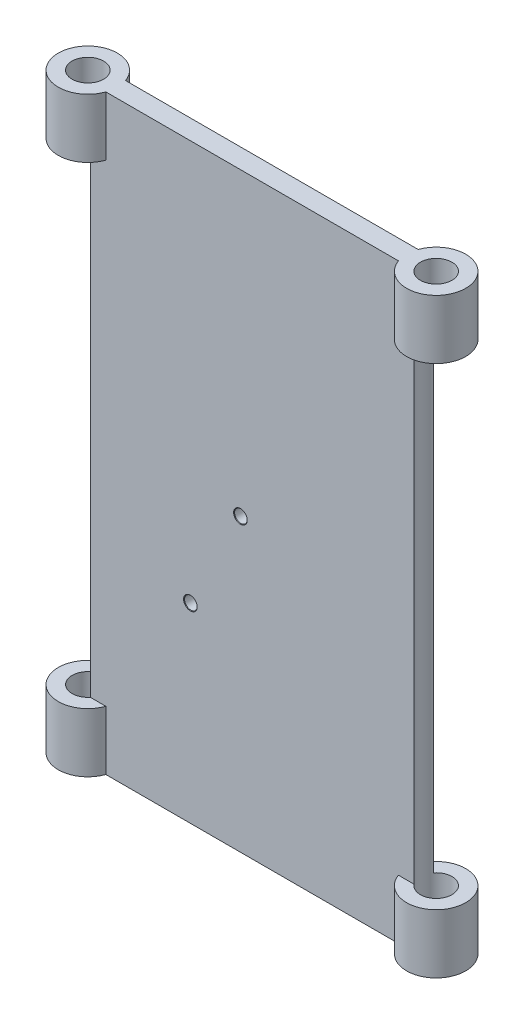
ISO-10303-21;
HEADER;
FILE_DESCRIPTION(('STEP AP214'),'2;1');
FILE_NAME('part.step','',(''),(''),'','','');
FILE_SCHEMA(('AUTOMOTIVE_DESIGN { 1 0 10303 214 1 1 1 1 }'));
ENDSEC;
DATA;
#1=APPLICATION_CONTEXT('core data for automotive mechanical design processes');
#2=APPLICATION_PROTOCOL_DEFINITION('international standard','automotive_design',2000,#1);
#3=PRODUCT_CONTEXT('',#1,'mechanical');
#4=PRODUCT('Part','Part','',(#3));
#5=PRODUCT_RELATED_PRODUCT_CATEGORY('part','',(#4));
#6=PRODUCT_DEFINITION_FORMATION('','',#4);
#7=PRODUCT_DEFINITION_CONTEXT('part definition',#1,'design');
#8=PRODUCT_DEFINITION('design','',#6,#7);
#9=PRODUCT_DEFINITION_SHAPE('','',#8);
#10=(LENGTH_UNIT() NAMED_UNIT(*) SI_UNIT(.MILLI.,.METRE.));
#11=(NAMED_UNIT(*) PLANE_ANGLE_UNIT() SI_UNIT($,.RADIAN.));
#12=(NAMED_UNIT(*) SI_UNIT($,.STERADIAN.) SOLID_ANGLE_UNIT());
#13=UNCERTAINTY_MEASURE_WITH_UNIT(LENGTH_MEASURE(1.E-05),#10,'distance_accuracy_value','');
#14=(GEOMETRIC_REPRESENTATION_CONTEXT(3) GLOBAL_UNCERTAINTY_ASSIGNED_CONTEXT((#13)) GLOBAL_UNIT_ASSIGNED_CONTEXT((#10,
#11,#12)) REPRESENTATION_CONTEXT('',''));
#15=CARTESIAN_POINT('',(0.,0.,0.));
#16=DIRECTION('',(0.,0.,1.));
#17=DIRECTION('',(1.,0.,0.));
#18=AXIS2_PLACEMENT_3D('',#15,#16,#17);
#19=CARTESIAN_POINT('',(0.,0.,5.));
#20=DIRECTION('',(0.,0.,-1.));
#21=DIRECTION('',(-1.,0.,0.));
#22=AXIS2_PLACEMENT_3D('',#19,#20,#21);
#23=PLANE('',#22);
#24=CARTESIAN_POINT('',(41.2224989991992,73.8,5.));
#25=DIRECTION('',(0.,0.,1.));
#26=DIRECTION('',(1.,0.,0.));
#27=AXIS2_PLACEMENT_3D('',#24,#25,#26);
#28=CIRCLE('',#27,1.725);
#29=CARTESIAN_POINT('',(42.9474989991992,73.8,5.));
#30=VERTEX_POINT('',#29);
#31=EDGE_CURVE('E346',#30,#30,#28,.T.);
#32=ORIENTED_EDGE('',*,*,#31,.F.);
#33=EDGE_LOOP('',(#32));
#34=FACE_BOUND('',#33,.T.);
#35=DIRECTION('',(1.,0.,0.));
#36=VECTOR('',#35,1.);
#37=CARTESIAN_POINT('',(0.,0.,5.));
#38=LINE('',#37,#36);
#39=CARTESIAN_POINT('',(7.07106781186548,0.,5.));
#40=VERTEX_POINT('',#39);
#41=CARTESIAN_POINT('',(81.3189321881345,0.,5.));
#42=VERTEX_POINT('',#41);
#43=EDGE_CURVE('E186',#40,#42,#38,.T.);
#44=ORIENTED_EDGE('',*,*,#43,.T.);
#45=DIRECTION('',(0.,-1.,0.));
#46=VECTOR('',#45,1.);
#47=CARTESIAN_POINT('',(81.3189321881345,15.,5.));
#48=LINE('',#47,#46);
#49=CARTESIAN_POINT('',(81.3189321881345,15.,5.));
#50=VERTEX_POINT('',#49);
#51=EDGE_CURVE('E234',#50,#42,#48,.T.);
#52=ORIENTED_EDGE('',*,*,#51,.F.);
#53=DIRECTION('',(1.,0.,0.));
#54=VECTOR('',#53,1.);
#55=CARTESIAN_POINT('',(81.3189321881345,15.,5.));
#56=LINE('',#55,#54);
#57=CARTESIAN_POINT('',(85.2675010008008,15.,5.));
#58=VERTEX_POINT('',#57);
#59=EDGE_CURVE('E228',#50,#58,#56,.T.);
#60=ORIENTED_EDGE('',*,*,#59,.T.);
#61=DIRECTION('',(0.,1.,0.));
#62=VECTOR('',#61,1.);
#63=CARTESIAN_POINT('',(85.2675010008008,150.,5.));
#64=LINE('',#63,#62);
#65=CARTESIAN_POINT('',(85.2675010008008,135.,5.));
#66=VERTEX_POINT('',#65);
#67=EDGE_CURVE('E137',#58,#66,#64,.T.);
#68=ORIENTED_EDGE('',*,*,#67,.T.);
#69=DIRECTION('',(1.,0.,0.));
#70=VECTOR('',#69,1.);
#71=CARTESIAN_POINT('',(0.,135.,5.));
#72=LINE('',#71,#70);
#73=CARTESIAN_POINT('',(81.3189321881345,135.,5.));
#74=VERTEX_POINT('',#73);
#75=EDGE_CURVE('E179',#74,#66,#72,.T.);
#76=ORIENTED_EDGE('',*,*,#75,.F.);
#77=DIRECTION('',(0.,1.,0.));
#78=VECTOR('',#77,1.);
#79=CARTESIAN_POINT('',(81.3189321881345,135.,5.));
#80=LINE('',#79,#78);
#81=CARTESIAN_POINT('',(81.3189321881345,150.,5.));
#82=VERTEX_POINT('',#81);
#83=EDGE_CURVE('E182',#74,#82,#80,.T.);
#84=ORIENTED_EDGE('',*,*,#83,.T.);
#85=DIRECTION('',(-1.,0.,0.));
#86=VECTOR('',#85,1.);
#87=CARTESIAN_POINT('',(0.,150.,5.));
#88=LINE('',#87,#86);
#89=CARTESIAN_POINT('',(7.07106781186548,150.,5.));
#90=VERTEX_POINT('',#89);
#91=EDGE_CURVE('E189',#82,#90,#88,.T.);
#92=ORIENTED_EDGE('',*,*,#91,.T.);
#93=DIRECTION('',(0.,1.,0.));
#94=VECTOR('',#93,1.);
#95=CARTESIAN_POINT('',(7.07106781186548,135.,5.));
#96=LINE('',#95,#94);
#97=CARTESIAN_POINT('',(7.07106781186548,135.,5.));
#98=VERTEX_POINT('',#97);
#99=EDGE_CURVE('E176',#90,#98,#96,.F.);
#100=ORIENTED_EDGE('',*,*,#99,.T.);
#101=DIRECTION('',(1.,0.,0.));
#102=VECTOR('',#101,1.);
#103=CARTESIAN_POINT('',(0.,135.,5.));
#104=LINE('',#103,#102);
#105=CARTESIAN_POINT('',(3.12249899919921,135.,5.));
#106=VERTEX_POINT('',#105);
#107=EDGE_CURVE('E168',#106,#98,#104,.T.);
#108=ORIENTED_EDGE('',*,*,#107,.F.);
#109=DIRECTION('',(0.,1.,0.));
#110=VECTOR('',#109,1.);
#111=CARTESIAN_POINT('',(3.12249899919921,150.,5.));
#112=LINE('',#111,#110);
#113=CARTESIAN_POINT('',(3.12249899919921,15.,5.));
#114=VERTEX_POINT('',#113);
#115=EDGE_CURVE('E161',#106,#114,#112,.F.);
#116=ORIENTED_EDGE('',*,*,#115,.T.);
#117=DIRECTION('',(1.,0.,0.));
#118=VECTOR('',#117,1.);
#119=CARTESIAN_POINT('',(3.1224989991992,15.,4.99999999999999));
#120=LINE('',#119,#118);
#121=CARTESIAN_POINT('',(7.07106781186548,15.,5.));
#122=VERTEX_POINT('',#121);
#123=EDGE_CURVE('E245',#114,#122,#120,.T.);
#124=ORIENTED_EDGE('',*,*,#123,.T.);
#125=DIRECTION('',(0.,-1.,0.));
#126=VECTOR('',#125,1.);
#127=CARTESIAN_POINT('',(7.07106781186548,15.,5.));
#128=LINE('',#127,#126);
#129=EDGE_CURVE('E238',#122,#40,#128,.T.);
#130=ORIENTED_EDGE('',*,*,#129,.T.);
#131=EDGE_LOOP('',(#44,#52,#60,#68,#76,#84,#92,#100,#108,#116,#124,#130));
#132=FACE_BOUND('',#131,.T.);
#133=CARTESIAN_POINT('',(28.5224989991992,48.4,5.));
#134=DIRECTION('',(0.,0.,1.));
#135=DIRECTION('',(1.,0.,0.));
#136=AXIS2_PLACEMENT_3D('',#133,#134,#135);
#137=CIRCLE('',#136,1.725);
#138=CARTESIAN_POINT('',(30.2474989991992,48.4,5.));
#139=VERTEX_POINT('',#138);
#140=EDGE_CURVE('E216',#139,#139,#137,.T.);
#141=ORIENTED_EDGE('',*,*,#140,.F.);
#142=EDGE_LOOP('',(#141));
#143=FACE_BOUND('',#142,.T.);
#144=ADVANCED_FACE('F39',(#34,#132,#143),#23,.F.);
#145=CARTESIAN_POINT('',(88.39,150.,2.5));
#146=DIRECTION('',(0.,1.,0.));
#147=DIRECTION('',(0.,0.,1.));
#148=AXIS2_PLACEMENT_3D('',#145,#146,#147);
#149=CYLINDRICAL_SURFACE('',#148,4.);
#150=CARTESIAN_POINT('',(88.39,150.,2.5));
#151=DIRECTION('',(0.,1.,0.));
#152=DIRECTION('',(0.,0.,1.));
#153=AXIS2_PLACEMENT_3D('',#150,#151,#152);
#154=CIRCLE('',#153,4.00000000000002);
#155=CARTESIAN_POINT('',(88.39,150.,6.50000000000002));
#156=VERTEX_POINT('',#155);
#157=EDGE_CURVE('E156',#156,#156,#154,.T.);
#158=ORIENTED_EDGE('',*,*,#157,.T.);
#159=EDGE_LOOP('',(#158));
#160=FACE_BOUND('',#159,.T.);
#161=ORIENTED_EDGE('',*,*,#67,.F.);
#162=CARTESIAN_POINT('',(88.39,15.,2.5));
#163=DIRECTION('',(0.,-1.,0.));
#164=DIRECTION('',(0.,0.,-1.));
#165=AXIS2_PLACEMENT_3D('',#162,#163,#164);
#166=CIRCLE('',#165,4.00000000000002);
#167=CARTESIAN_POINT('',(85.2675010008008,15.,0.));
#168=VERTEX_POINT('',#167);
#169=EDGE_CURVE('E48',#168,#58,#166,.T.);
#170=ORIENTED_EDGE('',*,*,#169,.F.);
#171=DIRECTION('',(0.,1.,0.));
#172=VECTOR('',#171,1.);
#173=CARTESIAN_POINT('',(85.2675010008008,150.,0.));
#174=LINE('',#173,#172);
#175=CARTESIAN_POINT('',(85.2675010008008,135.,0.));
#176=VERTEX_POINT('',#175);
#177=EDGE_CURVE('E135',#168,#176,#174,.T.);
#178=ORIENTED_EDGE('',*,*,#177,.T.);
#179=CARTESIAN_POINT('',(88.39,135.,2.5));
#180=DIRECTION('',(0.,1.,0.));
#181=DIRECTION('',(0.,0.,1.));
#182=AXIS2_PLACEMENT_3D('',#179,#180,#181);
#183=CIRCLE('',#182,4.);
#184=EDGE_CURVE('E204',#66,#176,#183,.T.);
#185=ORIENTED_EDGE('',*,*,#184,.F.);
#186=EDGE_LOOP('',(#161,#170,#178,#185));
#187=FACE_BOUND('',#186,.T.);
#188=CARTESIAN_POINT('',(88.39,0.,2.5));
#189=DIRECTION('',(0.,1.,0.));
#190=DIRECTION('',(0.,0.,1.));
#191=AXIS2_PLACEMENT_3D('',#188,#189,#190);
#192=CIRCLE('',#191,4.00000000000002);
#193=CARTESIAN_POINT('',(88.39,0.,6.50000000000002));
#194=VERTEX_POINT('',#193);
#195=EDGE_CURVE('E208',#194,#194,#192,.T.);
#196=ORIENTED_EDGE('',*,*,#195,.F.);
#197=EDGE_LOOP('',(#196));
#198=FACE_BOUND('',#197,.T.);
#199=ADVANCED_FACE('F131',(#160,#187,#198),#149,.F.);
#200=CARTESIAN_POINT('',(0.,150.,2.5));
#201=DIRECTION('',(0.,1.,0.));
#202=DIRECTION('',(0.,0.,1.));
#203=AXIS2_PLACEMENT_3D('',#200,#201,#202);
#204=CYLINDRICAL_SURFACE('',#203,4.);
#205=CARTESIAN_POINT('',(0.,150.,2.5));
#206=DIRECTION('',(0.,1.,0.));
#207=DIRECTION('',(0.,0.,1.));
#208=AXIS2_PLACEMENT_3D('',#205,#206,#207);
#209=CIRCLE('',#208,4.00000000000001);
#210=CARTESIAN_POINT('',(0.,150.,6.50000000000001));
#211=VERTEX_POINT('',#210);
#212=EDGE_CURVE('E236',#211,#211,#209,.T.);
#213=ORIENTED_EDGE('',*,*,#212,.T.);
#214=EDGE_LOOP('',(#213));
#215=FACE_BOUND('',#214,.T.);
#216=DIRECTION('',(0.,1.,0.));
#217=VECTOR('',#216,1.);
#218=CARTESIAN_POINT('',(3.12249899919921,150.,0.));
#219=LINE('',#218,#217);
#220=CARTESIAN_POINT('',(3.12249899919921,135.,0.));
#221=VERTEX_POINT('',#220);
#222=CARTESIAN_POINT('',(3.12249899919919,15.,0.));
#223=VERTEX_POINT('',#222);
#224=EDGE_CURVE('E141',#221,#223,#219,.F.);
#225=ORIENTED_EDGE('',*,*,#224,.T.);
#226=CARTESIAN_POINT('',(0.,15.,2.5));
#227=DIRECTION('',(0.,-1.,0.));
#228=DIRECTION('',(0.,0.,-1.));
#229=AXIS2_PLACEMENT_3D('',#226,#227,#228);
#230=CIRCLE('',#229,4.00000000000001);
#231=EDGE_CURVE('E11',#114,#223,#230,.T.);
#232=ORIENTED_EDGE('',*,*,#231,.F.);
#233=ORIENTED_EDGE('',*,*,#115,.F.);
#234=CARTESIAN_POINT('',(0.,135.,2.5));
#235=DIRECTION('',(0.,1.,0.));
#236=DIRECTION('',(0.,0.,1.));
#237=AXIS2_PLACEMENT_3D('',#234,#235,#236);
#238=CIRCLE('',#237,4.);
#239=EDGE_CURVE('E56',#221,#106,#238,.T.);
#240=ORIENTED_EDGE('',*,*,#239,.F.);
#241=EDGE_LOOP('',(#225,#232,#233,#240));
#242=FACE_BOUND('',#241,.T.);
#243=CARTESIAN_POINT('',(0.,0.,2.5));
#244=DIRECTION('',(0.,1.,0.));
#245=DIRECTION('',(0.,0.,1.));
#246=AXIS2_PLACEMENT_3D('',#243,#244,#245);
#247=CIRCLE('',#246,4.00000000000001);
#248=CARTESIAN_POINT('',(0.,0.,6.50000000000001));
#249=VERTEX_POINT('',#248);
#250=EDGE_CURVE('E213',#249,#249,#247,.T.);
#251=ORIENTED_EDGE('',*,*,#250,.F.);
#252=EDGE_LOOP('',(#251));
#253=FACE_BOUND('',#252,.T.);
#254=ADVANCED_FACE('F259',(#215,#242,#253),#204,.F.);
#255=CARTESIAN_POINT('',(0.,150.,5.));
#256=DIRECTION('',(0.,-1.,0.));
#257=DIRECTION('',(0.,0.,-1.));
#258=AXIS2_PLACEMENT_3D('',#255,#256,#257);
#259=PLANE('',#258);
#260=ORIENTED_EDGE('',*,*,#212,.F.);
#261=EDGE_LOOP('',(#260));
#262=FACE_BOUND('',#261,.T.);
#263=ORIENTED_EDGE('',*,*,#91,.F.);
#264=CARTESIAN_POINT('',(88.39,150.,2.5));
#265=DIRECTION('',(0.,1.,0.));
#266=DIRECTION('',(0.,0.,1.));
#267=AXIS2_PLACEMENT_3D('',#264,#265,#266);
#268=CIRCLE('',#267,7.50000000000001);
#269=CARTESIAN_POINT('',(81.3189321881345,150.,0.));
#270=VERTEX_POINT('',#269);
#271=EDGE_CURVE('E64',#82,#270,#268,.T.);
#272=ORIENTED_EDGE('',*,*,#271,.T.);
#273=DIRECTION('',(-1.,0.,0.));
#274=VECTOR('',#273,1.);
#275=CARTESIAN_POINT('',(0.,150.,0.));
#276=LINE('',#275,#274);
#277=CARTESIAN_POINT('',(7.07106781186548,150.,0.));
#278=VERTEX_POINT('',#277);
#279=EDGE_CURVE('E190',#270,#278,#276,.T.);
#280=ORIENTED_EDGE('',*,*,#279,.T.);
#281=CARTESIAN_POINT('',(0.,150.,2.5));
#282=DIRECTION('',(0.,1.,0.));
#283=DIRECTION('',(0.,0.,1.));
#284=AXIS2_PLACEMENT_3D('',#281,#282,#283);
#285=CIRCLE('',#284,7.5);
#286=EDGE_CURVE('E170',#278,#90,#285,.T.);
#287=ORIENTED_EDGE('',*,*,#286,.T.);
#288=EDGE_LOOP('',(#263,#272,#280,#287));
#289=FACE_BOUND('',#288,.T.);
#290=ORIENTED_EDGE('',*,*,#157,.F.);
#291=EDGE_LOOP('',(#290));
#292=FACE_BOUND('',#291,.T.);
#293=ADVANCED_FACE('F269',(#262,#289,#292),#259,.F.);
#294=CARTESIAN_POINT('',(0.,0.,5.));
#295=DIRECTION('',(0.,1.,0.));
#296=DIRECTION('',(0.,0.,1.));
#297=AXIS2_PLACEMENT_3D('',#294,#295,#296);
#298=PLANE('',#297);
#299=ORIENTED_EDGE('',*,*,#250,.T.);
#300=EDGE_LOOP('',(#299));
#301=FACE_BOUND('',#300,.T.);
#302=ORIENTED_EDGE('',*,*,#195,.T.);
#303=EDGE_LOOP('',(#302));
#304=FACE_BOUND('',#303,.T.);
#305=ORIENTED_EDGE('',*,*,#43,.F.);
#306=CARTESIAN_POINT('',(0.,0.,2.5));
#307=DIRECTION('',(0.,-1.,0.));
#308=DIRECTION('',(0.,0.,-1.));
#309=AXIS2_PLACEMENT_3D('',#306,#307,#308);
#310=CIRCLE('',#309,7.5);
#311=CARTESIAN_POINT('',(7.07106781186548,0.,0.));
#312=VERTEX_POINT('',#311);
#313=EDGE_CURVE('E233',#40,#312,#310,.T.);
#314=ORIENTED_EDGE('',*,*,#313,.T.);
#315=DIRECTION('',(1.,0.,0.));
#316=VECTOR('',#315,1.);
#317=CARTESIAN_POINT('',(0.,0.,0.));
#318=LINE('',#317,#316);
#319=CARTESIAN_POINT('',(81.3189321881345,0.,0.));
#320=VERTEX_POINT('',#319);
#321=EDGE_CURVE('E185',#312,#320,#318,.T.);
#322=ORIENTED_EDGE('',*,*,#321,.T.);
#323=CARTESIAN_POINT('',(88.39,0.,2.5));
#324=DIRECTION('',(0.,-1.,0.));
#325=DIRECTION('',(0.,0.,-1.));
#326=AXIS2_PLACEMENT_3D('',#323,#324,#325);
#327=CIRCLE('',#326,7.50000000000002);
#328=EDGE_CURVE('E150',#320,#42,#327,.T.);
#329=ORIENTED_EDGE('',*,*,#328,.T.);
#330=EDGE_LOOP('',(#305,#314,#322,#329));
#331=FACE_BOUND('',#330,.T.);
#332=ADVANCED_FACE('F41',(#301,#304,#331),#298,.F.);
#333=CARTESIAN_POINT('',(0.,0.,0.));
#334=DIRECTION('',(0.,0.,-1.));
#335=DIRECTION('',(-1.,0.,0.));
#336=AXIS2_PLACEMENT_3D('',#333,#334,#335);
#337=PLANE('',#336);
#338=CARTESIAN_POINT('',(41.2224989991992,73.8,0.));
#339=DIRECTION('',(0.,0.,-1.));
#340=DIRECTION('',(-1.,0.,0.));
#341=AXIS2_PLACEMENT_3D('',#338,#339,#340);
#342=CIRCLE('',#341,1.6);
#343=CARTESIAN_POINT('',(39.6224989991992,73.8,0.));
#344=VERTEX_POINT('',#343);
#345=EDGE_CURVE('E43',#344,#344,#342,.T.);
#346=ORIENTED_EDGE('',*,*,#345,.F.);
#347=EDGE_LOOP('',(#346));
#348=FACE_BOUND('',#347,.T.);
#349=CARTESIAN_POINT('',(28.5224989991992,48.4,0.));
#350=DIRECTION('',(0.,0.,-1.));
#351=DIRECTION('',(-1.,0.,0.));
#352=AXIS2_PLACEMENT_3D('',#349,#350,#351);
#353=CIRCLE('',#352,1.6);
#354=CARTESIAN_POINT('',(26.9224989991992,48.4,0.));
#355=VERTEX_POINT('',#354);
#356=EDGE_CURVE('E206',#355,#355,#353,.T.);
#357=ORIENTED_EDGE('',*,*,#356,.F.);
#358=EDGE_LOOP('',(#357));
#359=FACE_BOUND('',#358,.T.);
#360=DIRECTION('',(0.,-1.,0.));
#361=VECTOR('',#360,1.);
#362=CARTESIAN_POINT('',(81.3189321881345,15.,0.));
#363=LINE('',#362,#361);
#364=CARTESIAN_POINT('',(81.3189321881345,15.,0.));
#365=VERTEX_POINT('',#364);
#366=EDGE_CURVE('E230',#365,#320,#363,.T.);
#367=ORIENTED_EDGE('',*,*,#366,.T.);
#368=ORIENTED_EDGE('',*,*,#321,.F.);
#369=DIRECTION('',(0.,-1.,0.));
#370=VECTOR('',#369,1.);
#371=CARTESIAN_POINT('',(7.07106781186548,15.,0.));
#372=LINE('',#371,#370);
#373=CARTESIAN_POINT('',(7.07106781186548,15.,0.));
#374=VERTEX_POINT('',#373);
#375=EDGE_CURVE('E225',#374,#312,#372,.T.);
#376=ORIENTED_EDGE('',*,*,#375,.F.);
#377=DIRECTION('',(-1.,0.,0.));
#378=VECTOR('',#377,1.);
#379=CARTESIAN_POINT('',(3.12249899919919,15.,0.));
#380=LINE('',#379,#378);
#381=EDGE_CURVE('E241',#374,#223,#380,.T.);
#382=ORIENTED_EDGE('',*,*,#381,.T.);
#383=ORIENTED_EDGE('',*,*,#224,.F.);
#384=DIRECTION('',(1.,0.,0.));
#385=VECTOR('',#384,1.);
#386=CARTESIAN_POINT('',(0.,135.,0.));
#387=LINE('',#386,#385);
#388=CARTESIAN_POINT('',(7.07106781186548,135.,0.));
#389=VERTEX_POINT('',#388);
#390=EDGE_CURVE('E193',#221,#389,#387,.T.);
#391=ORIENTED_EDGE('',*,*,#390,.T.);
#392=DIRECTION('',(0.,1.,0.));
#393=VECTOR('',#392,1.);
#394=CARTESIAN_POINT('',(7.07106781186548,135.,0.));
#395=LINE('',#394,#393);
#396=EDGE_CURVE('E198',#278,#389,#395,.F.);
#397=ORIENTED_EDGE('',*,*,#396,.F.);
#398=ORIENTED_EDGE('',*,*,#279,.F.);
#399=DIRECTION('',(0.,1.,0.));
#400=VECTOR('',#399,1.);
#401=CARTESIAN_POINT('',(81.3189321881345,135.,0.));
#402=LINE('',#401,#400);
#403=CARTESIAN_POINT('',(81.3189321881345,135.,0.));
#404=VERTEX_POINT('',#403);
#405=EDGE_CURVE('E202',#404,#270,#402,.T.);
#406=ORIENTED_EDGE('',*,*,#405,.F.);
#407=DIRECTION('',(1.,0.,0.));
#408=VECTOR('',#407,1.);
#409=CARTESIAN_POINT('',(0.,135.,0.));
#410=LINE('',#409,#408);
#411=EDGE_CURVE('E155',#404,#176,#410,.T.);
#412=ORIENTED_EDGE('',*,*,#411,.T.);
#413=ORIENTED_EDGE('',*,*,#177,.F.);
#414=DIRECTION('',(-1.,0.,0.));
#415=VECTOR('',#414,1.);
#416=CARTESIAN_POINT('',(81.3189321881345,15.,0.));
#417=LINE('',#416,#415);
#418=EDGE_CURVE('E145',#168,#365,#417,.T.);
#419=ORIENTED_EDGE('',*,*,#418,.T.);
#420=EDGE_LOOP('',(#367,#368,#376,#382,#383,#391,#397,#398,#406,#412,#413,#419));
#421=FACE_BOUND('',#420,.T.);
#422=ADVANCED_FACE('F153',(#348,#359,#421),#337,.T.);
#423=CARTESIAN_POINT('',(0.,135.,2.5));
#424=DIRECTION('',(0.,1.,0.));
#425=DIRECTION('',(0.,0.,1.));
#426=AXIS2_PLACEMENT_3D('',#423,#424,#425);
#427=CYLINDRICAL_SURFACE('',#426,7.5);
#428=ORIENTED_EDGE('',*,*,#99,.F.);
#429=ORIENTED_EDGE('',*,*,#286,.F.);
#430=ORIENTED_EDGE('',*,*,#396,.T.);
#431=CARTESIAN_POINT('',(0.,135.,2.5));
#432=DIRECTION('',(0.,1.,0.));
#433=DIRECTION('',(0.,0.,1.));
#434=AXIS2_PLACEMENT_3D('',#431,#432,#433);
#435=CIRCLE('',#434,7.5);
#436=EDGE_CURVE('E158',#389,#98,#435,.T.);
#437=ORIENTED_EDGE('',*,*,#436,.T.);
#438=EDGE_LOOP('',(#428,#429,#430,#437));
#439=FACE_BOUND('',#438,.T.);
#440=ADVANCED_FACE('F268',(#439),#427,.T.);
#441=CARTESIAN_POINT('',(0.,135.,2.5));
#442=DIRECTION('',(0.,1.,0.));
#443=DIRECTION('',(0.,0.,1.));
#444=AXIS2_PLACEMENT_3D('',#441,#442,#443);
#445=PLANE('',#444);
#446=ORIENTED_EDGE('',*,*,#390,.F.);
#447=ORIENTED_EDGE('',*,*,#239,.T.);
#448=ORIENTED_EDGE('',*,*,#107,.T.);
#449=ORIENTED_EDGE('',*,*,#436,.F.);
#450=EDGE_LOOP('',(#446,#447,#448,#449));
#451=FACE_BOUND('',#450,.T.);
#452=ADVANCED_FACE('F263',(#451),#445,.F.);
#453=CARTESIAN_POINT('',(88.39,135.,2.5));
#454=DIRECTION('',(0.,1.,0.));
#455=DIRECTION('',(0.,0.,1.));
#456=AXIS2_PLACEMENT_3D('',#453,#454,#455);
#457=CYLINDRICAL_SURFACE('',#456,7.50000000000001);
#458=ORIENTED_EDGE('',*,*,#83,.F.);
#459=CARTESIAN_POINT('',(88.39,135.,2.5));
#460=DIRECTION('',(0.,1.,0.));
#461=DIRECTION('',(0.,0.,1.));
#462=AXIS2_PLACEMENT_3D('',#459,#460,#461);
#463=CIRCLE('',#462,7.50000000000001);
#464=EDGE_CURVE('E165',#74,#404,#463,.T.);
#465=ORIENTED_EDGE('',*,*,#464,.T.);
#466=ORIENTED_EDGE('',*,*,#405,.T.);
#467=ORIENTED_EDGE('',*,*,#271,.F.);
#468=EDGE_LOOP('',(#458,#465,#466,#467));
#469=FACE_BOUND('',#468,.T.);
#470=ADVANCED_FACE('F274',(#469),#457,.T.);
#471=CARTESIAN_POINT('',(88.39,135.,2.5));
#472=DIRECTION('',(0.,1.,0.));
#473=DIRECTION('',(0.,0.,1.));
#474=AXIS2_PLACEMENT_3D('',#471,#472,#473);
#475=PLANE('',#474);
#476=ORIENTED_EDGE('',*,*,#75,.T.);
#477=ORIENTED_EDGE('',*,*,#184,.T.);
#478=ORIENTED_EDGE('',*,*,#411,.F.);
#479=ORIENTED_EDGE('',*,*,#464,.F.);
#480=EDGE_LOOP('',(#476,#477,#478,#479));
#481=FACE_BOUND('',#480,.T.);
#482=ADVANCED_FACE('F276',(#481),#475,.F.);
#483=CARTESIAN_POINT('',(0.,15.,2.5));
#484=DIRECTION('',(0.,-1.,0.));
#485=DIRECTION('',(0.,0.,-1.));
#486=AXIS2_PLACEMENT_3D('',#483,#484,#485);
#487=CYLINDRICAL_SURFACE('',#486,7.5);
#488=ORIENTED_EDGE('',*,*,#313,.F.);
#489=ORIENTED_EDGE('',*,*,#129,.F.);
#490=CARTESIAN_POINT('',(0.,15.,2.5));
#491=DIRECTION('',(0.,-1.,0.));
#492=DIRECTION('',(0.,0.,-1.));
#493=AXIS2_PLACEMENT_3D('',#490,#491,#492);
#494=CIRCLE('',#493,7.5);
#495=EDGE_CURVE('E248',#122,#374,#494,.T.);
#496=ORIENTED_EDGE('',*,*,#495,.T.);
#497=ORIENTED_EDGE('',*,*,#375,.T.);
#498=EDGE_LOOP('',(#488,#489,#496,#497));
#499=FACE_BOUND('',#498,.T.);
#500=ADVANCED_FACE('F278',(#499),#487,.T.);
#501=CARTESIAN_POINT('',(0.,15.,2.5));
#502=DIRECTION('',(0.,-1.,0.));
#503=DIRECTION('',(0.,0.,-1.));
#504=AXIS2_PLACEMENT_3D('',#501,#502,#503);
#505=PLANE('',#504);
#506=ORIENTED_EDGE('',*,*,#123,.F.);
#507=ORIENTED_EDGE('',*,*,#231,.T.);
#508=ORIENTED_EDGE('',*,*,#381,.F.);
#509=ORIENTED_EDGE('',*,*,#495,.F.);
#510=EDGE_LOOP('',(#506,#507,#508,#509));
#511=FACE_BOUND('',#510,.T.);
#512=ADVANCED_FACE('F284',(#511),#505,.F.);
#513=CARTESIAN_POINT('',(88.39,15.,2.5));
#514=DIRECTION('',(0.,-1.,0.));
#515=DIRECTION('',(0.,0.,-1.));
#516=AXIS2_PLACEMENT_3D('',#513,#514,#515);
#517=CYLINDRICAL_SURFACE('',#516,7.50000000000002);
#518=ORIENTED_EDGE('',*,*,#328,.F.);
#519=ORIENTED_EDGE('',*,*,#366,.F.);
#520=CARTESIAN_POINT('',(88.39,15.,2.5));
#521=DIRECTION('',(0.,-1.,0.));
#522=DIRECTION('',(0.,0.,-1.));
#523=AXIS2_PLACEMENT_3D('',#520,#521,#522);
#524=CIRCLE('',#523,7.50000000000002);
#525=EDGE_CURVE('E147',#365,#50,#524,.T.);
#526=ORIENTED_EDGE('',*,*,#525,.T.);
#527=ORIENTED_EDGE('',*,*,#51,.T.);
#528=EDGE_LOOP('',(#518,#519,#526,#527));
#529=FACE_BOUND('',#528,.T.);
#530=ADVANCED_FACE('F318',(#529),#517,.T.);
#531=CARTESIAN_POINT('',(88.39,15.,2.5));
#532=DIRECTION('',(0.,-1.,0.));
#533=DIRECTION('',(0.,0.,-1.));
#534=AXIS2_PLACEMENT_3D('',#531,#532,#533);
#535=PLANE('',#534);
#536=ORIENTED_EDGE('',*,*,#418,.F.);
#537=ORIENTED_EDGE('',*,*,#169,.T.);
#538=ORIENTED_EDGE('',*,*,#59,.F.);
#539=ORIENTED_EDGE('',*,*,#525,.F.);
#540=EDGE_LOOP('',(#536,#537,#538,#539));
#541=FACE_BOUND('',#540,.T.);
#542=ADVANCED_FACE('F146',(#541),#535,.F.);
#543=CARTESIAN_POINT('',(28.5224989991992,48.4,5.));
#544=DIRECTION('',(0.,0.,1.));
#545=DIRECTION('',(1.,0.,0.));
#546=AXIS2_PLACEMENT_3D('',#543,#544,#545);
#547=CYLINDRICAL_SURFACE('',#546,1.6);
#548=ORIENTED_EDGE('',*,*,#356,.T.);
#549=EDGE_LOOP('',(#548));
#550=FACE_BOUND('',#549,.T.);
#551=CARTESIAN_POINT('',(28.5224989991992,48.4,4.875));
#552=DIRECTION('',(0.,0.,1.));
#553=DIRECTION('',(1.,0.,0.));
#554=AXIS2_PLACEMENT_3D('',#551,#552,#553);
#555=CIRCLE('',#554,1.6);
#556=CARTESIAN_POINT('',(30.1224989991992,48.4,4.875));
#557=VERTEX_POINT('',#556);
#558=EDGE_CURVE('E209',#557,#557,#555,.T.);
#559=ORIENTED_EDGE('',*,*,#558,.T.);
#560=EDGE_LOOP('',(#559));
#561=FACE_BOUND('',#560,.T.);
#562=ADVANCED_FACE('F325',(#550,#561),#547,.F.);
#563=CARTESIAN_POINT('',(28.5224989991992,48.4,5.));
#564=DIRECTION('',(0.,0.,1.));
#565=DIRECTION('',(1.,0.,0.));
#566=AXIS2_PLACEMENT_3D('',#563,#564,#565);
#567=CONICAL_SURFACE('',#566,1.725,0.785398163397462);
#568=ORIENTED_EDGE('',*,*,#558,.F.);
#569=EDGE_LOOP('',(#568));
#570=FACE_BOUND('',#569,.T.);
#571=ORIENTED_EDGE('',*,*,#140,.T.);
#572=EDGE_LOOP('',(#571));
#573=FACE_BOUND('',#572,.T.);
#574=ADVANCED_FACE('F328',(#570,#573),#567,.F.);
#575=CARTESIAN_POINT('',(41.2224989991992,73.8,5.));
#576=DIRECTION('',(0.,0.,1.));
#577=DIRECTION('',(1.,0.,0.));
#578=AXIS2_PLACEMENT_3D('',#575,#576,#577);
#579=CYLINDRICAL_SURFACE('',#578,1.6);
#580=ORIENTED_EDGE('',*,*,#345,.T.);
#581=EDGE_LOOP('',(#580));
#582=FACE_BOUND('',#581,.T.);
#583=CARTESIAN_POINT('',(41.2224989991992,73.8,4.875));
#584=DIRECTION('',(0.,0.,1.));
#585=DIRECTION('',(1.,0.,0.));
#586=AXIS2_PLACEMENT_3D('',#583,#584,#585);
#587=CIRCLE('',#586,1.6);
#588=CARTESIAN_POINT('',(42.8224989991992,73.8,4.875));
#589=VERTEX_POINT('',#588);
#590=EDGE_CURVE('E344',#589,#589,#587,.T.);
#591=ORIENTED_EDGE('',*,*,#590,.T.);
#592=EDGE_LOOP('',(#591));
#593=FACE_BOUND('',#592,.T.);
#594=ADVANCED_FACE('F331',(#582,#593),#579,.F.);
#595=CARTESIAN_POINT('',(41.2224989991992,73.8,5.));
#596=DIRECTION('',(0.,0.,1.));
#597=DIRECTION('',(1.,0.,0.));
#598=AXIS2_PLACEMENT_3D('',#595,#596,#597);
#599=CONICAL_SURFACE('',#598,1.725,0.785398163397448);
#600=ORIENTED_EDGE('',*,*,#590,.F.);
#601=EDGE_LOOP('',(#600));
#602=FACE_BOUND('',#601,.T.);
#603=ORIENTED_EDGE('',*,*,#31,.T.);
#604=EDGE_LOOP('',(#603));
#605=FACE_BOUND('',#604,.T.);
#606=ADVANCED_FACE('F335',(#602,#605),#599,.F.);
#607=CLOSED_SHELL('',(#144,#199,#254,#293,#332,#422,#440,#452,#470,#482,#500,#512,#530,#542,
#562,#574,#594,#606));
#608=MANIFOLD_SOLID_BREP('B2',#607);
#609=ADVANCED_BREP_SHAPE_REPRESENTATION('',(#18,#608),#14);
#610=SHAPE_DEFINITION_REPRESENTATION(#9,#609);
ENDSEC;
END-ISO-10303-21;
